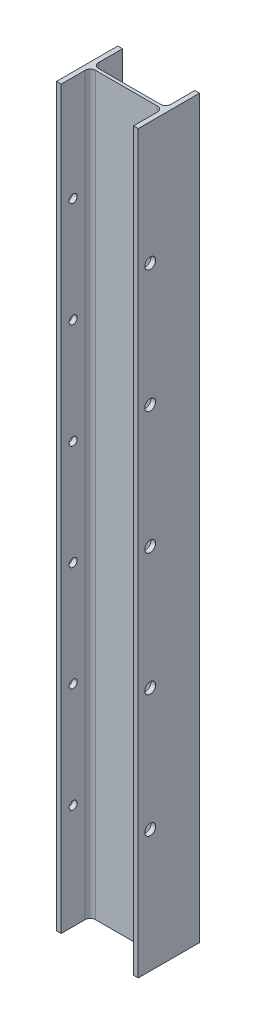
ISO-10303-21;
HEADER;
FILE_DESCRIPTION(('STEP AP214'),'2;1');
FILE_NAME('part.step','',(''),(''),'','','');
FILE_SCHEMA(('AUTOMOTIVE_DESIGN { 1 0 10303 214 1 1 1 1 }'));
ENDSEC;
DATA;
#1=APPLICATION_CONTEXT('core data for automotive mechanical design processes');
#2=APPLICATION_PROTOCOL_DEFINITION('international standard','automotive_design',2000,#1);
#3=PRODUCT_CONTEXT('',#1,'mechanical');
#4=PRODUCT('Part','Part','',(#3));
#5=PRODUCT_RELATED_PRODUCT_CATEGORY('part','',(#4));
#6=PRODUCT_DEFINITION_FORMATION('','',#4);
#7=PRODUCT_DEFINITION_CONTEXT('part definition',#1,'design');
#8=PRODUCT_DEFINITION('design','',#6,#7);
#9=PRODUCT_DEFINITION_SHAPE('','',#8);
#10=(LENGTH_UNIT() NAMED_UNIT(*) SI_UNIT(.MILLI.,.METRE.));
#11=(NAMED_UNIT(*) PLANE_ANGLE_UNIT() SI_UNIT($,.RADIAN.));
#12=(NAMED_UNIT(*) SI_UNIT($,.STERADIAN.) SOLID_ANGLE_UNIT());
#13=UNCERTAINTY_MEASURE_WITH_UNIT(LENGTH_MEASURE(1.E-05),#10,'distance_accuracy_value','');
#14=(GEOMETRIC_REPRESENTATION_CONTEXT(3) GLOBAL_UNCERTAINTY_ASSIGNED_CONTEXT((#13)) GLOBAL_UNIT_ASSIGNED_CONTEXT((#10,
#11,#12)) REPRESENTATION_CONTEXT('',''));
#15=CARTESIAN_POINT('',(0.,0.,0.));
#16=DIRECTION('',(0.,0.,1.));
#17=DIRECTION('',(1.,0.,0.));
#18=AXIS2_PLACEMENT_3D('',#15,#16,#17);
#19=CARTESIAN_POINT('',(98.9330000000001,457.2,-1.38777878078145E-13));
#20=DIRECTION('',(1.,0.,0.));
#21=DIRECTION('',(0.,0.,-1.));
#22=AXIS2_PLACEMENT_3D('',#19,#20,#21);
#23=PLANE('',#22);
#24=CARTESIAN_POINT('',(98.9330000000001,-304.8,-14.9225000000001));
#25=DIRECTION('',(-1.,0.,0.));
#26=DIRECTION('',(0.,0.,1.));
#27=AXIS2_PLACEMENT_3D('',#24,#25,#26);
#28=CIRCLE('',#27,6.74624000000001);
#29=CARTESIAN_POINT('',(98.9330000000001,-304.8,-8.17626000000013));
#30=VERTEX_POINT('',#29);
#31=EDGE_CURVE('E627',#30,#30,#28,.T.);
#32=ORIENTED_EDGE('',*,*,#31,.F.);
#33=EDGE_LOOP('',(#32));
#34=FACE_BOUND('',#33,.T.);
#35=CARTESIAN_POINT('',(98.9330000000001,152.4,-14.9225000000001));
#36=DIRECTION('',(-1.,0.,0.));
#37=DIRECTION('',(0.,0.,1.));
#38=AXIS2_PLACEMENT_3D('',#35,#36,#37);
#39=CIRCLE('',#38,6.74623999999999);
#40=CARTESIAN_POINT('',(98.9330000000001,152.4,-8.17626000000015));
#41=VERTEX_POINT('',#40);
#42=EDGE_CURVE('E639',#41,#41,#39,.T.);
#43=ORIENTED_EDGE('',*,*,#42,.F.);
#44=EDGE_LOOP('',(#43));
#45=FACE_BOUND('',#44,.T.);
#46=DIRECTION('',(0.,0.,1.));
#47=VECTOR('',#46,1.);
#48=CARTESIAN_POINT('',(98.9330000000001,-457.2,-1.38777878078145E-13));
#49=LINE('',#48,#47);
#50=CARTESIAN_POINT('',(98.933,-457.2,-29.8450000000001));
#51=VERTEX_POINT('',#50);
#52=CARTESIAN_POINT('',(98.9330000000001,-457.2,-1.38777878078145E-13));
#53=VERTEX_POINT('',#52);
#54=EDGE_CURVE('E166',#51,#53,#49,.T.);
#55=ORIENTED_EDGE('',*,*,#54,.T.);
#56=DIRECTION('',(0.,-1.,0.));
#57=VECTOR('',#56,1.);
#58=CARTESIAN_POINT('',(98.9330000000001,457.2,-1.38777878078145E-13));
#59=LINE('',#58,#57);
#60=CARTESIAN_POINT('',(98.9330000000001,457.2,-1.38777878078145E-13));
#61=VERTEX_POINT('',#60);
#62=EDGE_CURVE('E233',#61,#53,#59,.T.);
#63=ORIENTED_EDGE('',*,*,#62,.F.);
#64=DIRECTION('',(0.,0.,1.));
#65=VECTOR('',#64,1.);
#66=CARTESIAN_POINT('',(98.9330000000001,457.2,-1.38777878078145E-13));
#67=LINE('',#66,#65);
#68=CARTESIAN_POINT('',(98.933,457.2,-29.8450000000001));
#69=VERTEX_POINT('',#68);
#70=EDGE_CURVE('E221',#69,#61,#67,.T.);
#71=ORIENTED_EDGE('',*,*,#70,.F.);
#72=DIRECTION('',(0.,-1.,0.));
#73=VECTOR('',#72,1.);
#74=CARTESIAN_POINT('',(98.933,457.2,-29.8450000000001));
#75=LINE('',#74,#73);
#76=EDGE_CURVE('E228',#69,#51,#75,.T.);
#77=ORIENTED_EDGE('',*,*,#76,.T.);
#78=EDGE_LOOP('',(#55,#63,#71,#77));
#79=FACE_BOUND('',#78,.T.);
#80=CARTESIAN_POINT('',(98.9330000000001,304.8,-14.9225000000001));
#81=DIRECTION('',(-1.,0.,0.));
#82=DIRECTION('',(0.,0.,1.));
#83=AXIS2_PLACEMENT_3D('',#80,#81,#82);
#84=CIRCLE('',#83,6.74624000000001);
#85=CARTESIAN_POINT('',(98.9330000000001,304.8,-8.17626000000013));
#86=VERTEX_POINT('',#85);
#87=EDGE_CURVE('E441',#86,#86,#84,.T.);
#88=ORIENTED_EDGE('',*,*,#87,.F.);
#89=EDGE_LOOP('',(#88));
#90=FACE_BOUND('',#89,.T.);
#91=CARTESIAN_POINT('',(98.9330000000001,0.,-14.9225000000001));
#92=DIRECTION('',(-1.,0.,0.));
#93=DIRECTION('',(0.,0.,1.));
#94=AXIS2_PLACEMENT_3D('',#91,#92,#93);
#95=CIRCLE('',#94,6.74624);
#96=CARTESIAN_POINT('',(98.9330000000001,0.,-8.17626000000014));
#97=VERTEX_POINT('',#96);
#98=EDGE_CURVE('E635',#97,#97,#95,.T.);
#99=ORIENTED_EDGE('',*,*,#98,.F.);
#100=EDGE_LOOP('',(#99));
#101=FACE_BOUND('',#100,.T.);
#102=CARTESIAN_POINT('',(98.9330000000001,-152.4,-14.9225000000001));
#103=DIRECTION('',(-1.,0.,0.));
#104=DIRECTION('',(0.,0.,1.));
#105=AXIS2_PLACEMENT_3D('',#102,#103,#104);
#106=CIRCLE('',#105,6.74623999999999);
#107=CARTESIAN_POINT('',(98.9330000000001,-152.4,-8.17626000000015));
#108=VERTEX_POINT('',#107);
#109=EDGE_CURVE('E629',#108,#108,#106,.T.);
#110=ORIENTED_EDGE('',*,*,#109,.F.);
#111=EDGE_LOOP('',(#110));
#112=FACE_BOUND('',#111,.T.);
#113=ADVANCED_FACE('F96',(#34,#45,#79,#90,#101,#112),#23,.F.);
#114=CARTESIAN_POINT('',(3.17500000000012,457.2,1.87350135405495E-13));
#115=DIRECTION('',(1.,0.,0.));
#116=DIRECTION('',(0.,0.,-1.));
#117=AXIS2_PLACEMENT_3D('',#114,#115,#116);
#118=PLANE('',#117);
#119=CARTESIAN_POINT('',(3.17500000000006,-65.3142858594286,-14.9224999999999));
#120=DIRECTION('',(-1.,0.,0.));
#121=DIRECTION('',(0.,0.,1.));
#122=AXIS2_PLACEMENT_3D('',#119,#120,#121);
#123=CIRCLE('',#122,5.0419);
#124=CARTESIAN_POINT('',(3.17500000000008,-65.3142858594286,-9.88059999999991));
#125=VERTEX_POINT('',#124);
#126=EDGE_CURVE('E458',#125,#125,#123,.T.);
#127=ORIENTED_EDGE('',*,*,#126,.F.);
#128=EDGE_LOOP('',(#127));
#129=FACE_BOUND('',#128,.T.);
#130=CARTESIAN_POINT('',(3.17500000000006,65.3142854965714,-14.9224999999999));
#131=DIRECTION('',(-1.,0.,0.));
#132=DIRECTION('',(0.,0.,1.));
#133=AXIS2_PLACEMENT_3D('',#130,#131,#132);
#134=CIRCLE('',#133,5.0419);
#135=CARTESIAN_POINT('',(3.17500000000008,65.3142854965714,-9.88059999999991));
#136=VERTEX_POINT('',#135);
#137=EDGE_CURVE('E464',#136,#136,#134,.T.);
#138=ORIENTED_EDGE('',*,*,#137,.F.);
#139=EDGE_LOOP('',(#138));
#140=FACE_BOUND('',#139,.T.);
#141=CARTESIAN_POINT('',(3.17500000000006,195.942856852571,-14.9224999999999));
#142=DIRECTION('',(-1.,0.,0.));
#143=DIRECTION('',(0.,0.,1.));
#144=AXIS2_PLACEMENT_3D('',#141,#142,#143);
#145=CIRCLE('',#144,5.04189999999999);
#146=CARTESIAN_POINT('',(3.17500000000008,195.942856852571,-9.88059999999992));
#147=VERTEX_POINT('',#146);
#148=EDGE_CURVE('E470',#147,#147,#145,.T.);
#149=ORIENTED_EDGE('',*,*,#148,.F.);
#150=EDGE_LOOP('',(#149));
#151=FACE_BOUND('',#150,.T.);
#152=CARTESIAN_POINT('',(3.17500000000006,326.571428208571,-14.9224999999999));
#153=DIRECTION('',(-1.,0.,0.));
#154=DIRECTION('',(0.,0.,1.));
#155=AXIS2_PLACEMENT_3D('',#152,#153,#154);
#156=CIRCLE('',#155,5.04189999999999);
#157=CARTESIAN_POINT('',(3.17500000000008,326.571428208571,-9.88059999999992));
#158=VERTEX_POINT('',#157);
#159=EDGE_CURVE('E476',#158,#158,#156,.T.);
#160=ORIENTED_EDGE('',*,*,#159,.F.);
#161=EDGE_LOOP('',(#160));
#162=FACE_BOUND('',#161,.T.);
#163=DIRECTION('',(0.,0.,1.));
#164=VECTOR('',#163,1.);
#165=CARTESIAN_POINT('',(3.17500000000012,-457.2,1.87350135405495E-13));
#166=LINE('',#165,#164);
#167=CARTESIAN_POINT('',(3.17499999999985,-457.2,-76.1999999999998));
#168=VERTEX_POINT('',#167);
#169=CARTESIAN_POINT('',(3.17500000000012,-457.2,1.87350135405495E-13));
#170=VERTEX_POINT('',#169);
#171=EDGE_CURVE('E259',#168,#170,#166,.T.);
#172=ORIENTED_EDGE('',*,*,#171,.T.);
#173=DIRECTION('',(0.,-1.,0.));
#174=VECTOR('',#173,1.);
#175=CARTESIAN_POINT('',(3.17500000000012,457.2,1.87350135405495E-13));
#176=LINE('',#175,#174);
#177=CARTESIAN_POINT('',(3.17500000000012,457.2,1.87350135405495E-13));
#178=VERTEX_POINT('',#177);
#179=EDGE_CURVE('E285',#178,#170,#176,.T.);
#180=ORIENTED_EDGE('',*,*,#179,.F.);
#181=DIRECTION('',(0.,0.,1.));
#182=VECTOR('',#181,1.);
#183=CARTESIAN_POINT('',(3.17500000000012,457.2,1.87350135405495E-13));
#184=LINE('',#183,#182);
#185=CARTESIAN_POINT('',(3.17499999999985,457.2,-76.1999999999998));
#186=VERTEX_POINT('',#185);
#187=EDGE_CURVE('E339',#186,#178,#184,.T.);
#188=ORIENTED_EDGE('',*,*,#187,.F.);
#189=DIRECTION('',(0.,-1.,0.));
#190=VECTOR('',#189,1.);
#191=CARTESIAN_POINT('',(3.17499999999985,457.2,-76.1999999999998));
#192=LINE('',#191,#190);
#193=EDGE_CURVE('E288',#186,#168,#192,.T.);
#194=ORIENTED_EDGE('',*,*,#193,.T.);
#195=EDGE_LOOP('',(#172,#180,#188,#194));
#196=FACE_BOUND('',#195,.T.);
#197=CARTESIAN_POINT('',(3.17500000000006,-326.571428571429,-14.9224999999999));
#198=DIRECTION('',(-1.,0.,0.));
#199=DIRECTION('',(0.,0.,1.));
#200=AXIS2_PLACEMENT_3D('',#197,#198,#199);
#201=CIRCLE('',#200,5.04189999999999);
#202=CARTESIAN_POINT('',(3.17500000000008,-326.571428571429,-9.88059999999992));
#203=VERTEX_POINT('',#202);
#204=EDGE_CURVE('E452',#203,#203,#201,.T.);
#205=ORIENTED_EDGE('',*,*,#204,.F.);
#206=EDGE_LOOP('',(#205));
#207=FACE_BOUND('',#206,.T.);
#208=CARTESIAN_POINT('',(3.17500000000006,-195.942857215429,-14.9224999999999));
#209=DIRECTION('',(-1.,0.,0.));
#210=DIRECTION('',(0.,0.,1.));
#211=AXIS2_PLACEMENT_3D('',#208,#209,#210);
#212=CIRCLE('',#211,5.04189999999999);
#213=CARTESIAN_POINT('',(3.17500000000008,-195.942857215429,-9.88059999999992));
#214=VERTEX_POINT('',#213);
#215=EDGE_CURVE('E440',#214,#214,#212,.T.);
#216=ORIENTED_EDGE('',*,*,#215,.F.);
#217=EDGE_LOOP('',(#216));
#218=FACE_BOUND('',#217,.T.);
#219=ADVANCED_FACE('F371',(#129,#140,#151,#162,#196,#207,#218),#118,.F.);
#220=CARTESIAN_POINT('',(104.775,457.2,-76.2000000000002));
#221=DIRECTION('',(-1.,0.,0.));
#222=DIRECTION('',(0.,0.,1.));
#223=AXIS2_PLACEMENT_3D('',#220,#221,#222);
#224=PLANE('',#223);
#225=CARTESIAN_POINT('',(104.775,-304.8,-14.9225000000002));
#226=DIRECTION('',(-1.,0.,0.));
#227=DIRECTION('',(0.,0.,1.));
#228=AXIS2_PLACEMENT_3D('',#225,#226,#227);
#229=CIRCLE('',#228,6.74624000000001);
#230=CARTESIAN_POINT('',(104.775,-304.8,-8.17626000000015));
#231=VERTEX_POINT('',#230);
#232=EDGE_CURVE('E423',#231,#231,#229,.T.);
#233=ORIENTED_EDGE('',*,*,#232,.T.);
#234=EDGE_LOOP('',(#233));
#235=FACE_BOUND('',#234,.T.);
#236=CARTESIAN_POINT('',(104.775,-152.4,-14.9225000000002));
#237=DIRECTION('',(-1.,0.,0.));
#238=DIRECTION('',(0.,0.,1.));
#239=AXIS2_PLACEMENT_3D('',#236,#237,#238);
#240=CIRCLE('',#239,6.74623999999999);
#241=CARTESIAN_POINT('',(104.775,-152.4,-8.17626000000018));
#242=VERTEX_POINT('',#241);
#243=EDGE_CURVE('E427',#242,#242,#240,.T.);
#244=ORIENTED_EDGE('',*,*,#243,.T.);
#245=EDGE_LOOP('',(#244));
#246=FACE_BOUND('',#245,.T.);
#247=CARTESIAN_POINT('',(104.775,0.,-14.9225000000002));
#248=DIRECTION('',(-1.,0.,0.));
#249=DIRECTION('',(0.,0.,1.));
#250=AXIS2_PLACEMENT_3D('',#247,#248,#249);
#251=CIRCLE('',#250,6.74624);
#252=CARTESIAN_POINT('',(104.775,0.,-8.17626000000016));
#253=VERTEX_POINT('',#252);
#254=EDGE_CURVE('E431',#253,#253,#251,.T.);
#255=ORIENTED_EDGE('',*,*,#254,.T.);
#256=EDGE_LOOP('',(#255));
#257=FACE_BOUND('',#256,.T.);
#258=CARTESIAN_POINT('',(104.775,152.4,-14.9225000000002));
#259=DIRECTION('',(-1.,0.,0.));
#260=DIRECTION('',(0.,0.,1.));
#261=AXIS2_PLACEMENT_3D('',#258,#259,#260);
#262=CIRCLE('',#261,6.74623999999999);
#263=CARTESIAN_POINT('',(104.775,152.4,-8.17626000000018));
#264=VERTEX_POINT('',#263);
#265=EDGE_CURVE('E435',#264,#264,#262,.T.);
#266=ORIENTED_EDGE('',*,*,#265,.T.);
#267=EDGE_LOOP('',(#266));
#268=FACE_BOUND('',#267,.T.);
#269=CARTESIAN_POINT('',(104.775,304.8,-14.9225000000002));
#270=DIRECTION('',(-1.,0.,0.));
#271=DIRECTION('',(0.,0.,1.));
#272=AXIS2_PLACEMENT_3D('',#269,#270,#271);
#273=CIRCLE('',#272,6.74624000000001);
#274=CARTESIAN_POINT('',(104.775,304.8,-8.17626000000015));
#275=VERTEX_POINT('',#274);
#276=EDGE_CURVE('E438',#275,#275,#273,.T.);
#277=ORIENTED_EDGE('',*,*,#276,.T.);
#278=EDGE_LOOP('',(#277));
#279=FACE_BOUND('',#278,.T.);
#280=DIRECTION('',(0.,0.,-1.));
#281=VECTOR('',#280,1.);
#282=CARTESIAN_POINT('',(104.775,-457.2,-76.2000000000002));
#283=LINE('',#282,#281);
#284=CARTESIAN_POINT('',(104.775,-457.2,-1.59594559789866E-13));
#285=VERTEX_POINT('',#284);
#286=CARTESIAN_POINT('',(104.775,-457.2,-76.2000000000002));
#287=VERTEX_POINT('',#286);
#288=EDGE_CURVE('E241',#285,#287,#283,.T.);
#289=ORIENTED_EDGE('',*,*,#288,.T.);
#290=DIRECTION('',(0.,-1.,0.));
#291=VECTOR('',#290,1.);
#292=CARTESIAN_POINT('',(104.775,457.2,-76.2000000000002));
#293=LINE('',#292,#291);
#294=CARTESIAN_POINT('',(104.775,457.2,-76.2000000000002));
#295=VERTEX_POINT('',#294);
#296=EDGE_CURVE('E13',#295,#287,#293,.T.);
#297=ORIENTED_EDGE('',*,*,#296,.F.);
#298=DIRECTION('',(0.,0.,-1.));
#299=VECTOR('',#298,1.);
#300=CARTESIAN_POINT('',(104.775,457.2,-76.2000000000002));
#301=LINE('',#300,#299);
#302=CARTESIAN_POINT('',(104.775,457.2,-1.59594559789866E-13));
#303=VERTEX_POINT('',#302);
#304=EDGE_CURVE('E272',#303,#295,#301,.T.);
#305=ORIENTED_EDGE('',*,*,#304,.F.);
#306=DIRECTION('',(0.,-1.,0.));
#307=VECTOR('',#306,1.);
#308=CARTESIAN_POINT('',(104.775,457.2,-1.59594559789866E-13));
#309=LINE('',#308,#307);
#310=EDGE_CURVE('E237',#303,#285,#309,.T.);
#311=ORIENTED_EDGE('',*,*,#310,.T.);
#312=EDGE_LOOP('',(#289,#297,#305,#311));
#313=FACE_BOUND('',#312,.T.);
#314=ADVANCED_FACE('F98',(#235,#246,#257,#268,#279,#313),#224,.F.);
#315=CARTESIAN_POINT('',(98.9329999999999,457.2,-76.2000000000002));
#316=DIRECTION('',(0.,0.,1.));
#317=DIRECTION('',(1.,0.,0.));
#318=AXIS2_PLACEMENT_3D('',#315,#316,#317);
#319=PLANE('',#318);
#320=DIRECTION('',(-1.,0.,0.));
#321=VECTOR('',#320,1.);
#322=CARTESIAN_POINT('',(98.9329999999999,-457.2,-76.2000000000002));
#323=LINE('',#322,#321);
#324=CARTESIAN_POINT('',(98.9329999999999,-457.2,-76.2000000000002));
#325=VERTEX_POINT('',#324);
#326=EDGE_CURVE('E244',#287,#325,#323,.T.);
#327=ORIENTED_EDGE('',*,*,#326,.T.);
#328=DIRECTION('',(0.,-1.,0.));
#329=VECTOR('',#328,1.);
#330=CARTESIAN_POINT('',(98.9329999999999,457.2,-76.2000000000002));
#331=LINE('',#330,#329);
#332=CARTESIAN_POINT('',(98.9329999999999,457.2,-76.2000000000002));
#333=VERTEX_POINT('',#332);
#334=EDGE_CURVE('E105',#333,#325,#331,.T.);
#335=ORIENTED_EDGE('',*,*,#334,.F.);
#336=DIRECTION('',(-1.,0.,0.));
#337=VECTOR('',#336,1.);
#338=CARTESIAN_POINT('',(98.9329999999999,457.2,-76.2000000000002));
#339=LINE('',#338,#337);
#340=EDGE_CURVE('E180',#295,#333,#339,.T.);
#341=ORIENTED_EDGE('',*,*,#340,.F.);
#342=ORIENTED_EDGE('',*,*,#296,.T.);
#343=EDGE_LOOP('',(#327,#335,#341,#342));
#344=FACE_BOUND('',#343,.T.);
#345=ADVANCED_FACE('F412',(#344),#319,.F.);
#346=CARTESIAN_POINT('',(98.933,457.2,-46.3550000000002));
#347=DIRECTION('',(1.,0.,0.));
#348=DIRECTION('',(0.,0.,-1.));
#349=AXIS2_PLACEMENT_3D('',#346,#347,#348);
#350=PLANE('',#349);
#351=DIRECTION('',(0.,0.,1.));
#352=VECTOR('',#351,1.);
#353=CARTESIAN_POINT('',(98.933,-457.2,-46.3550000000002));
#354=LINE('',#353,#352);
#355=CARTESIAN_POINT('',(98.933,-457.2,-46.3550000000002));
#356=VERTEX_POINT('',#355);
#357=EDGE_CURVE('E247',#325,#356,#354,.T.);
#358=ORIENTED_EDGE('',*,*,#357,.T.);
#359=DIRECTION('',(0.,-1.,0.));
#360=VECTOR('',#359,1.);
#361=CARTESIAN_POINT('',(98.933,457.2,-46.3550000000002));
#362=LINE('',#361,#360);
#363=CARTESIAN_POINT('',(98.933,457.2,-46.3550000000002));
#364=VERTEX_POINT('',#363);
#365=EDGE_CURVE('E303',#364,#356,#362,.T.);
#366=ORIENTED_EDGE('',*,*,#365,.F.);
#367=DIRECTION('',(0.,0.,1.));
#368=VECTOR('',#367,1.);
#369=CARTESIAN_POINT('',(98.933,457.2,-46.3550000000002));
#370=LINE('',#369,#368);
#371=EDGE_CURVE('E311',#333,#364,#370,.T.);
#372=ORIENTED_EDGE('',*,*,#371,.F.);
#373=ORIENTED_EDGE('',*,*,#334,.T.);
#374=EDGE_LOOP('',(#358,#366,#372,#373));
#375=FACE_BOUND('',#374,.T.);
#376=ADVANCED_FACE('F309',(#375),#350,.F.);
#377=CARTESIAN_POINT('',(92.5829999999999,457.2,-46.3550000000001));
#378=DIRECTION('',(0.,-1.,0.));
#379=DIRECTION('',(0.,0.,-1.));
#380=AXIS2_PLACEMENT_3D('',#377,#378,#379);
#381=CYLINDRICAL_SURFACE('',#380,6.35000000000001);
#382=CARTESIAN_POINT('',(92.5829999999999,-457.2,-46.3550000000001));
#383=DIRECTION('',(0.,-1.,0.));
#384=DIRECTION('',(0.,0.,1.));
#385=AXIS2_PLACEMENT_3D('',#382,#383,#384);
#386=CIRCLE('',#385,6.35000000000001);
#387=CARTESIAN_POINT('',(92.583,-457.2,-40.0050000000002));
#388=VERTEX_POINT('',#387);
#389=EDGE_CURVE('E249',#356,#388,#386,.T.);
#390=ORIENTED_EDGE('',*,*,#389,.T.);
#391=DIRECTION('',(0.,-1.,0.));
#392=VECTOR('',#391,1.);
#393=CARTESIAN_POINT('',(92.583,457.2,-40.0050000000002));
#394=LINE('',#393,#392);
#395=CARTESIAN_POINT('',(92.583,457.2,-40.0050000000002));
#396=VERTEX_POINT('',#395);
#397=EDGE_CURVE('E300',#396,#388,#394,.T.);
#398=ORIENTED_EDGE('',*,*,#397,.F.);
#399=CARTESIAN_POINT('',(92.5829999999999,457.2,-46.3550000000001));
#400=DIRECTION('',(0.,-1.,0.));
#401=DIRECTION('',(0.,0.,1.));
#402=AXIS2_PLACEMENT_3D('',#399,#400,#401);
#403=CIRCLE('',#402,6.35000000000001);
#404=EDGE_CURVE('E329',#364,#396,#403,.T.);
#405=ORIENTED_EDGE('',*,*,#404,.F.);
#406=ORIENTED_EDGE('',*,*,#365,.T.);
#407=EDGE_LOOP('',(#390,#398,#405,#406));
#408=FACE_BOUND('',#407,.T.);
#409=ADVANCED_FACE('F320',(#408),#381,.F.);
#410=CARTESIAN_POINT('',(15.367,457.2,-40.0049999999999));
#411=DIRECTION('',(0.,0.,1.));
#412=DIRECTION('',(1.,0.,0.));
#413=AXIS2_PLACEMENT_3D('',#410,#411,#412);
#414=PLANE('',#413);
#415=DIRECTION('',(-1.,0.,0.));
#416=VECTOR('',#415,1.);
#417=CARTESIAN_POINT('',(15.367,-457.2,-40.0049999999999));
#418=LINE('',#417,#416);
#419=CARTESIAN_POINT('',(15.367,-457.2,-40.0049999999999));
#420=VERTEX_POINT('',#419);
#421=EDGE_CURVE('E251',#388,#420,#418,.T.);
#422=ORIENTED_EDGE('',*,*,#421,.T.);
#423=DIRECTION('',(0.,-1.,0.));
#424=VECTOR('',#423,1.);
#425=CARTESIAN_POINT('',(15.367,457.2,-40.0049999999999));
#426=LINE('',#425,#424);
#427=CARTESIAN_POINT('',(15.367,457.2,-40.0049999999999));
#428=VERTEX_POINT('',#427);
#429=EDGE_CURVE('E297',#428,#420,#426,.T.);
#430=ORIENTED_EDGE('',*,*,#429,.F.);
#431=DIRECTION('',(-1.,0.,0.));
#432=VECTOR('',#431,1.);
#433=CARTESIAN_POINT('',(15.367,457.2,-40.0049999999999));
#434=LINE('',#433,#432);
#435=EDGE_CURVE('E326',#396,#428,#434,.T.);
#436=ORIENTED_EDGE('',*,*,#435,.F.);
#437=ORIENTED_EDGE('',*,*,#397,.T.);
#438=EDGE_LOOP('',(#422,#430,#436,#437));
#439=FACE_BOUND('',#438,.T.);
#440=ADVANCED_FACE('F324',(#439),#414,.F.);
#441=CARTESIAN_POINT('',(15.367,457.2,-46.3549999999999));
#442=DIRECTION('',(0.,-1.,0.));
#443=DIRECTION('',(0.,0.,-1.));
#444=AXIS2_PLACEMENT_3D('',#441,#442,#443);
#445=CYLINDRICAL_SURFACE('',#444,6.35000000000001);
#446=CARTESIAN_POINT('',(15.367,-457.2,-46.3549999999999));
#447=DIRECTION('',(0.,-1.,0.));
#448=DIRECTION('',(0.,0.,1.));
#449=AXIS2_PLACEMENT_3D('',#446,#447,#448);
#450=CIRCLE('',#449,6.35000000000001);
#451=CARTESIAN_POINT('',(9.01699999999996,-457.2,-46.3549999999999));
#452=VERTEX_POINT('',#451);
#453=EDGE_CURVE('E253',#420,#452,#450,.T.);
#454=ORIENTED_EDGE('',*,*,#453,.T.);
#455=DIRECTION('',(0.,-1.,0.));
#456=VECTOR('',#455,1.);
#457=CARTESIAN_POINT('',(9.01699999999996,457.2,-46.3549999999999));
#458=LINE('',#457,#456);
#459=CARTESIAN_POINT('',(9.01699999999996,457.2,-46.3549999999999));
#460=VERTEX_POINT('',#459);
#461=EDGE_CURVE('E294',#460,#452,#458,.T.);
#462=ORIENTED_EDGE('',*,*,#461,.F.);
#463=CARTESIAN_POINT('',(15.367,457.2,-46.3549999999999));
#464=DIRECTION('',(0.,-1.,0.));
#465=DIRECTION('',(0.,0.,1.));
#466=AXIS2_PLACEMENT_3D('',#463,#464,#465);
#467=CIRCLE('',#466,6.35000000000001);
#468=EDGE_CURVE('E328',#428,#460,#467,.T.);
#469=ORIENTED_EDGE('',*,*,#468,.F.);
#470=ORIENTED_EDGE('',*,*,#429,.T.);
#471=EDGE_LOOP('',(#454,#462,#469,#470));
#472=FACE_BOUND('',#471,.T.);
#473=ADVANCED_FACE('F402',(#472),#445,.F.);
#474=CARTESIAN_POINT('',(9.01699999999987,457.2,-76.1999999999999));
#475=DIRECTION('',(-1.,0.,0.));
#476=DIRECTION('',(0.,0.,1.));
#477=AXIS2_PLACEMENT_3D('',#474,#475,#476);
#478=PLANE('',#477);
#479=DIRECTION('',(0.,0.,-1.));
#480=VECTOR('',#479,1.);
#481=CARTESIAN_POINT('',(9.01699999999987,-457.2,-76.1999999999999));
#482=LINE('',#481,#480);
#483=CARTESIAN_POINT('',(9.01699999999987,-457.2,-76.1999999999999));
#484=VERTEX_POINT('',#483);
#485=EDGE_CURVE('E255',#452,#484,#482,.T.);
#486=ORIENTED_EDGE('',*,*,#485,.T.);
#487=DIRECTION('',(0.,-1.,0.));
#488=VECTOR('',#487,1.);
#489=CARTESIAN_POINT('',(9.01699999999987,457.2,-76.1999999999999));
#490=LINE('',#489,#488);
#491=CARTESIAN_POINT('',(9.01699999999987,457.2,-76.1999999999999));
#492=VERTEX_POINT('',#491);
#493=EDGE_CURVE('E291',#492,#484,#490,.T.);
#494=ORIENTED_EDGE('',*,*,#493,.F.);
#495=DIRECTION('',(0.,0.,-1.));
#496=VECTOR('',#495,1.);
#497=CARTESIAN_POINT('',(9.01699999999987,457.2,-76.1999999999999));
#498=LINE('',#497,#496);
#499=EDGE_CURVE('E331',#460,#492,#498,.T.);
#500=ORIENTED_EDGE('',*,*,#499,.F.);
#501=ORIENTED_EDGE('',*,*,#461,.T.);
#502=EDGE_LOOP('',(#486,#494,#500,#501));
#503=FACE_BOUND('',#502,.T.);
#504=ADVANCED_FACE('F398',(#503),#478,.F.);
#505=CARTESIAN_POINT('',(3.17499999999985,457.2,-76.1999999999998));
#506=DIRECTION('',(0.,0.,1.));
#507=DIRECTION('',(1.,0.,0.));
#508=AXIS2_PLACEMENT_3D('',#505,#506,#507);
#509=PLANE('',#508);
#510=DIRECTION('',(-1.,0.,0.));
#511=VECTOR('',#510,1.);
#512=CARTESIAN_POINT('',(3.17499999999985,-457.2,-76.1999999999998));
#513=LINE('',#512,#511);
#514=EDGE_CURVE('E257',#484,#168,#513,.T.);
#515=ORIENTED_EDGE('',*,*,#514,.T.);
#516=ORIENTED_EDGE('',*,*,#193,.F.);
#517=DIRECTION('',(-1.,0.,0.));
#518=VECTOR('',#517,1.);
#519=CARTESIAN_POINT('',(3.17499999999985,457.2,-76.1999999999998));
#520=LINE('',#519,#518);
#521=EDGE_CURVE('E337',#492,#186,#520,.T.);
#522=ORIENTED_EDGE('',*,*,#521,.F.);
#523=ORIENTED_EDGE('',*,*,#493,.T.);
#524=EDGE_LOOP('',(#515,#516,#522,#523));
#525=FACE_BOUND('',#524,.T.);
#526=ADVANCED_FACE('F393',(#525),#509,.F.);
#527=CARTESIAN_POINT('',(9.01700000000014,457.2,1.94289029309402E-13));
#528=DIRECTION('',(0.,0.,-1.));
#529=DIRECTION('',(-1.,0.,0.));
#530=AXIS2_PLACEMENT_3D('',#527,#528,#529);
#531=PLANE('',#530);
#532=DIRECTION('',(1.,0.,0.));
#533=VECTOR('',#532,1.);
#534=CARTESIAN_POINT('',(9.01700000000014,-457.2,1.94289029309402E-13));
#535=LINE('',#534,#533);
#536=CARTESIAN_POINT('',(9.01700000000014,-457.2,1.94289029309402E-13));
#537=VERTEX_POINT('',#536);
#538=EDGE_CURVE('E261',#170,#537,#535,.T.);
#539=ORIENTED_EDGE('',*,*,#538,.T.);
#540=DIRECTION('',(0.,-1.,0.));
#541=VECTOR('',#540,1.);
#542=CARTESIAN_POINT('',(9.01700000000014,457.2,1.94289029309402E-13));
#543=LINE('',#542,#541);
#544=CARTESIAN_POINT('',(9.01700000000014,457.2,1.94289029309402E-13));
#545=VERTEX_POINT('',#544);
#546=EDGE_CURVE('E282',#545,#537,#543,.T.);
#547=ORIENTED_EDGE('',*,*,#546,.F.);
#548=DIRECTION('',(1.,0.,0.));
#549=VECTOR('',#548,1.);
#550=CARTESIAN_POINT('',(9.01700000000014,457.2,1.94289029309402E-13));
#551=LINE('',#550,#549);
#552=EDGE_CURVE('E341',#178,#545,#551,.T.);
#553=ORIENTED_EDGE('',*,*,#552,.F.);
#554=ORIENTED_EDGE('',*,*,#179,.T.);
#555=EDGE_LOOP('',(#539,#547,#553,#554));
#556=FACE_BOUND('',#555,.T.);
#557=ADVANCED_FACE('F390',(#556),#531,.F.);
#558=CARTESIAN_POINT('',(9.01700000000002,457.2,-29.8449999999998));
#559=DIRECTION('',(-1.,0.,0.));
#560=DIRECTION('',(0.,0.,1.));
#561=AXIS2_PLACEMENT_3D('',#558,#559,#560);
#562=PLANE('',#561);
#563=CARTESIAN_POINT('',(9.01700000000008,-195.942857215429,-14.9224999999999));
#564=DIRECTION('',(-1.,0.,0.));
#565=DIRECTION('',(0.,0.,1.));
#566=AXIS2_PLACEMENT_3D('',#563,#564,#565);
#567=CIRCLE('',#566,5.04189999999999);
#568=CARTESIAN_POINT('',(9.0170000000001,-195.942857215429,-9.88059999999994));
#569=VERTEX_POINT('',#568);
#570=EDGE_CURVE('E444',#569,#569,#567,.T.);
#571=ORIENTED_EDGE('',*,*,#570,.T.);
#572=EDGE_LOOP('',(#571));
#573=FACE_BOUND('',#572,.T.);
#574=CARTESIAN_POINT('',(9.01700000000008,-326.571428571429,-14.9224999999999));
#575=DIRECTION('',(-1.,0.,0.));
#576=DIRECTION('',(0.,0.,1.));
#577=AXIS2_PLACEMENT_3D('',#574,#575,#576);
#578=CIRCLE('',#577,5.04189999999999);
#579=CARTESIAN_POINT('',(9.0170000000001,-326.571428571429,-9.88059999999994));
#580=VERTEX_POINT('',#579);
#581=EDGE_CURVE('E455',#580,#580,#578,.T.);
#582=ORIENTED_EDGE('',*,*,#581,.T.);
#583=EDGE_LOOP('',(#582));
#584=FACE_BOUND('',#583,.T.);
#585=CARTESIAN_POINT('',(9.01700000000008,-65.3142858594286,-14.9224999999999));
#586=DIRECTION('',(-1.,0.,0.));
#587=DIRECTION('',(0.,0.,1.));
#588=AXIS2_PLACEMENT_3D('',#585,#586,#587);
#589=CIRCLE('',#588,5.04189999999999);
#590=CARTESIAN_POINT('',(9.0170000000001,-65.3142858594286,-9.88059999999994));
#591=VERTEX_POINT('',#590);
#592=EDGE_CURVE('E461',#591,#591,#589,.T.);
#593=ORIENTED_EDGE('',*,*,#592,.T.);
#594=EDGE_LOOP('',(#593));
#595=FACE_BOUND('',#594,.T.);
#596=CARTESIAN_POINT('',(9.01700000000008,65.3142854965714,-14.9224999999999));
#597=DIRECTION('',(-1.,0.,0.));
#598=DIRECTION('',(0.,0.,1.));
#599=AXIS2_PLACEMENT_3D('',#596,#597,#598);
#600=CIRCLE('',#599,5.04189999999999);
#601=CARTESIAN_POINT('',(9.0170000000001,65.3142854965714,-9.88059999999994));
#602=VERTEX_POINT('',#601);
#603=EDGE_CURVE('E467',#602,#602,#600,.T.);
#604=ORIENTED_EDGE('',*,*,#603,.T.);
#605=EDGE_LOOP('',(#604));
#606=FACE_BOUND('',#605,.T.);
#607=CARTESIAN_POINT('',(9.01700000000008,195.942856852571,-14.9224999999999));
#608=DIRECTION('',(-1.,0.,0.));
#609=DIRECTION('',(0.,0.,1.));
#610=AXIS2_PLACEMENT_3D('',#607,#608,#609);
#611=CIRCLE('',#610,5.04189999999999);
#612=CARTESIAN_POINT('',(9.0170000000001,195.942856852571,-9.88059999999994));
#613=VERTEX_POINT('',#612);
#614=EDGE_CURVE('E473',#613,#613,#611,.T.);
#615=ORIENTED_EDGE('',*,*,#614,.T.);
#616=EDGE_LOOP('',(#615));
#617=FACE_BOUND('',#616,.T.);
#618=CARTESIAN_POINT('',(9.01700000000008,326.571428208571,-14.9224999999999));
#619=DIRECTION('',(-1.,0.,0.));
#620=DIRECTION('',(0.,0.,1.));
#621=AXIS2_PLACEMENT_3D('',#618,#619,#620);
#622=CIRCLE('',#621,5.04189999999999);
#623=CARTESIAN_POINT('',(9.0170000000001,326.571428208571,-9.88059999999994));
#624=VERTEX_POINT('',#623);
#625=EDGE_CURVE('E245',#624,#624,#622,.T.);
#626=ORIENTED_EDGE('',*,*,#625,.T.);
#627=EDGE_LOOP('',(#626));
#628=FACE_BOUND('',#627,.T.);
#629=DIRECTION('',(0.,0.,-1.));
#630=VECTOR('',#629,1.);
#631=CARTESIAN_POINT('',(9.01700000000002,-457.2,-29.8449999999998));
#632=LINE('',#631,#630);
#633=CARTESIAN_POINT('',(9.01700000000003,-457.2,-29.8449999999998));
#634=VERTEX_POINT('',#633);
#635=EDGE_CURVE('E263',#537,#634,#632,.T.);
#636=ORIENTED_EDGE('',*,*,#635,.T.);
#637=DIRECTION('',(0.,-1.,0.));
#638=VECTOR('',#637,1.);
#639=CARTESIAN_POINT('',(9.01700000000003,457.2,-29.8449999999998));
#640=LINE('',#639,#638);
#641=CARTESIAN_POINT('',(9.01700000000003,457.2,-29.8449999999998));
#642=VERTEX_POINT('',#641);
#643=EDGE_CURVE('E279',#642,#634,#640,.T.);
#644=ORIENTED_EDGE('',*,*,#643,.F.);
#645=DIRECTION('',(0.,0.,-1.));
#646=VECTOR('',#645,1.);
#647=CARTESIAN_POINT('',(9.01700000000002,457.2,-29.8449999999998));
#648=LINE('',#647,#646);
#649=EDGE_CURVE('E343',#545,#642,#648,.T.);
#650=ORIENTED_EDGE('',*,*,#649,.F.);
#651=ORIENTED_EDGE('',*,*,#546,.T.);
#652=EDGE_LOOP('',(#636,#644,#650,#651));
#653=FACE_BOUND('',#652,.T.);
#654=ADVANCED_FACE('F387',(#573,#584,#595,#606,#617,#628,#653),#562,.F.);
#655=CARTESIAN_POINT('',(15.367,457.2,-29.8449999999999));
#656=DIRECTION('',(0.,-1.,0.));
#657=DIRECTION('',(0.,0.,-1.));
#658=AXIS2_PLACEMENT_3D('',#655,#656,#657);
#659=CYLINDRICAL_SURFACE('',#658,6.35000000000001);
#660=CARTESIAN_POINT('',(15.367,-457.2,-29.8449999999999));
#661=DIRECTION('',(0.,-1.,0.));
#662=DIRECTION('',(0.,0.,1.));
#663=AXIS2_PLACEMENT_3D('',#660,#661,#662);
#664=CIRCLE('',#663,6.35000000000001);
#665=CARTESIAN_POINT('',(15.367,-457.2,-36.1949999999999));
#666=VERTEX_POINT('',#665);
#667=EDGE_CURVE('E265',#634,#666,#664,.T.);
#668=ORIENTED_EDGE('',*,*,#667,.T.);
#669=DIRECTION('',(0.,-1.,0.));
#670=VECTOR('',#669,1.);
#671=CARTESIAN_POINT('',(15.367,457.2,-36.1949999999999));
#672=LINE('',#671,#670);
#673=CARTESIAN_POINT('',(15.367,457.2,-36.1949999999999));
#674=VERTEX_POINT('',#673);
#675=EDGE_CURVE('E276',#674,#666,#672,.T.);
#676=ORIENTED_EDGE('',*,*,#675,.F.);
#677=CARTESIAN_POINT('',(15.367,457.2,-29.8449999999999));
#678=DIRECTION('',(0.,-1.,0.));
#679=DIRECTION('',(0.,0.,1.));
#680=AXIS2_PLACEMENT_3D('',#677,#678,#679);
#681=CIRCLE('',#680,6.35000000000001);
#682=EDGE_CURVE('E345',#642,#674,#681,.T.);
#683=ORIENTED_EDGE('',*,*,#682,.F.);
#684=ORIENTED_EDGE('',*,*,#643,.T.);
#685=EDGE_LOOP('',(#668,#676,#683,#684));
#686=FACE_BOUND('',#685,.T.);
#687=ADVANCED_FACE('F351',(#686),#659,.F.);
#688=CARTESIAN_POINT('',(92.583,457.2,-36.1950000000001));
#689=DIRECTION('',(0.,0.,-1.));
#690=DIRECTION('',(-1.,0.,0.));
#691=AXIS2_PLACEMENT_3D('',#688,#689,#690);
#692=PLANE('',#691);
#693=DIRECTION('',(1.,0.,0.));
#694=VECTOR('',#693,1.);
#695=CARTESIAN_POINT('',(92.583,-457.2,-36.1950000000001));
#696=LINE('',#695,#694);
#697=CARTESIAN_POINT('',(92.583,-457.2,-36.1950000000001));
#698=VERTEX_POINT('',#697);
#699=EDGE_CURVE('E267',#666,#698,#696,.T.);
#700=ORIENTED_EDGE('',*,*,#699,.T.);
#701=DIRECTION('',(0.,-1.,0.));
#702=VECTOR('',#701,1.);
#703=CARTESIAN_POINT('',(92.583,457.2,-36.1950000000001));
#704=LINE('',#703,#702);
#705=CARTESIAN_POINT('',(92.583,457.2,-36.1950000000001));
#706=VERTEX_POINT('',#705);
#707=EDGE_CURVE('E232',#706,#698,#704,.T.);
#708=ORIENTED_EDGE('',*,*,#707,.F.);
#709=DIRECTION('',(1.,0.,0.));
#710=VECTOR('',#709,1.);
#711=CARTESIAN_POINT('',(92.583,457.2,-36.1950000000001));
#712=LINE('',#711,#710);
#713=EDGE_CURVE('E223',#674,#706,#712,.T.);
#714=ORIENTED_EDGE('',*,*,#713,.F.);
#715=ORIENTED_EDGE('',*,*,#675,.T.);
#716=EDGE_LOOP('',(#700,#708,#714,#715));
#717=FACE_BOUND('',#716,.T.);
#718=ADVANCED_FACE('F355',(#717),#692,.F.);
#719=CARTESIAN_POINT('',(92.583,457.2,-29.8450000000001));
#720=DIRECTION('',(0.,-1.,0.));
#721=DIRECTION('',(0.,0.,-1.));
#722=AXIS2_PLACEMENT_3D('',#719,#720,#721);
#723=CYLINDRICAL_SURFACE('',#722,6.35000000000001);
#724=CARTESIAN_POINT('',(92.583,-457.2,-29.8450000000001));
#725=DIRECTION('',(0.,-1.,0.));
#726=DIRECTION('',(0.,0.,1.));
#727=AXIS2_PLACEMENT_3D('',#724,#725,#726);
#728=CIRCLE('',#727,6.35000000000001);
#729=EDGE_CURVE('E231',#698,#51,#728,.T.);
#730=ORIENTED_EDGE('',*,*,#729,.T.);
#731=ORIENTED_EDGE('',*,*,#76,.F.);
#732=CARTESIAN_POINT('',(92.583,457.2,-29.8450000000001));
#733=DIRECTION('',(0.,-1.,0.));
#734=DIRECTION('',(0.,0.,1.));
#735=AXIS2_PLACEMENT_3D('',#732,#733,#734);
#736=CIRCLE('',#735,6.35000000000001);
#737=EDGE_CURVE('E217',#706,#69,#736,.T.);
#738=ORIENTED_EDGE('',*,*,#737,.F.);
#739=ORIENTED_EDGE('',*,*,#707,.T.);
#740=EDGE_LOOP('',(#730,#731,#738,#739));
#741=FACE_BOUND('',#740,.T.);
#742=ADVANCED_FACE('F229',(#741),#723,.F.);
#743=CARTESIAN_POINT('',(104.775,457.2,-1.59594559789866E-13));
#744=DIRECTION('',(0.,0.,-1.));
#745=DIRECTION('',(-1.,0.,0.));
#746=AXIS2_PLACEMENT_3D('',#743,#744,#745);
#747=PLANE('',#746);
#748=DIRECTION('',(1.,0.,0.));
#749=VECTOR('',#748,1.);
#750=CARTESIAN_POINT('',(104.775,-457.2,-1.59594559789866E-13));
#751=LINE('',#750,#749);
#752=EDGE_CURVE('E172',#53,#285,#751,.T.);
#753=ORIENTED_EDGE('',*,*,#752,.T.);
#754=ORIENTED_EDGE('',*,*,#310,.F.);
#755=DIRECTION('',(1.,0.,0.));
#756=VECTOR('',#755,1.);
#757=CARTESIAN_POINT('',(104.775,457.2,-1.59594559789866E-13));
#758=LINE('',#757,#756);
#759=EDGE_CURVE('E113',#61,#303,#758,.T.);
#760=ORIENTED_EDGE('',*,*,#759,.F.);
#761=ORIENTED_EDGE('',*,*,#62,.T.);
#762=EDGE_LOOP('',(#753,#754,#760,#761));
#763=FACE_BOUND('',#762,.T.);
#764=ADVANCED_FACE('F359',(#763),#747,.F.);
#765=CARTESIAN_POINT('',(92.583,457.2,-29.8450000000001));
#766=DIRECTION('',(0.,1.,0.));
#767=DIRECTION('',(0.,0.,1.));
#768=AXIS2_PLACEMENT_3D('',#765,#766,#767);
#769=PLANE('',#768);
#770=ORIENTED_EDGE('',*,*,#304,.T.);
#771=ORIENTED_EDGE('',*,*,#340,.T.);
#772=ORIENTED_EDGE('',*,*,#371,.T.);
#773=ORIENTED_EDGE('',*,*,#404,.T.);
#774=ORIENTED_EDGE('',*,*,#435,.T.);
#775=ORIENTED_EDGE('',*,*,#468,.T.);
#776=ORIENTED_EDGE('',*,*,#499,.T.);
#777=ORIENTED_EDGE('',*,*,#521,.T.);
#778=ORIENTED_EDGE('',*,*,#187,.T.);
#779=ORIENTED_EDGE('',*,*,#552,.T.);
#780=ORIENTED_EDGE('',*,*,#649,.T.);
#781=ORIENTED_EDGE('',*,*,#682,.T.);
#782=ORIENTED_EDGE('',*,*,#713,.T.);
#783=ORIENTED_EDGE('',*,*,#737,.T.);
#784=ORIENTED_EDGE('',*,*,#70,.T.);
#785=ORIENTED_EDGE('',*,*,#759,.T.);
#786=EDGE_LOOP('',(#770,#771,#772,#773,#774,#775,#776,#777,#778,#779,#780,#781,#782,#783,#784,#785));
#787=FACE_BOUND('',#786,.T.);
#788=ADVANCED_FACE('F219',(#787),#769,.T.);
#789=CARTESIAN_POINT('',(92.583,-457.2,-29.8450000000001));
#790=DIRECTION('',(0.,1.,0.));
#791=DIRECTION('',(0.,0.,1.));
#792=AXIS2_PLACEMENT_3D('',#789,#790,#791);
#793=PLANE('',#792);
#794=ORIENTED_EDGE('',*,*,#288,.F.);
#795=ORIENTED_EDGE('',*,*,#752,.F.);
#796=ORIENTED_EDGE('',*,*,#54,.F.);
#797=ORIENTED_EDGE('',*,*,#729,.F.);
#798=ORIENTED_EDGE('',*,*,#699,.F.);
#799=ORIENTED_EDGE('',*,*,#667,.F.);
#800=ORIENTED_EDGE('',*,*,#635,.F.);
#801=ORIENTED_EDGE('',*,*,#538,.F.);
#802=ORIENTED_EDGE('',*,*,#171,.F.);
#803=ORIENTED_EDGE('',*,*,#514,.F.);
#804=ORIENTED_EDGE('',*,*,#485,.F.);
#805=ORIENTED_EDGE('',*,*,#453,.F.);
#806=ORIENTED_EDGE('',*,*,#421,.F.);
#807=ORIENTED_EDGE('',*,*,#389,.F.);
#808=ORIENTED_EDGE('',*,*,#357,.F.);
#809=ORIENTED_EDGE('',*,*,#326,.F.);
#810=EDGE_LOOP('',(#794,#795,#796,#797,#798,#799,#800,#801,#802,#803,#804,#805,#806,#807,#808,#809));
#811=FACE_BOUND('',#810,.T.);
#812=ADVANCED_FACE('F315',(#811),#793,.F.);
#813=CARTESIAN_POINT('',(3.17500000000006,326.571428208571,-14.9224999999999));
#814=DIRECTION('',(-1.,0.,0.));
#815=DIRECTION('',(0.,0.,1.));
#816=AXIS2_PLACEMENT_3D('',#813,#814,#815);
#817=CYLINDRICAL_SURFACE('',#816,5.04189999999999);
#818=ORIENTED_EDGE('',*,*,#625,.F.);
#819=EDGE_LOOP('',(#818));
#820=FACE_BOUND('',#819,.T.);
#821=ORIENTED_EDGE('',*,*,#159,.T.);
#822=EDGE_LOOP('',(#821));
#823=FACE_BOUND('',#822,.T.);
#824=ADVANCED_FACE('F486',(#820,#823),#817,.F.);
#825=CARTESIAN_POINT('',(3.17500000000006,195.942856852571,-14.9224999999999));
#826=DIRECTION('',(-1.,0.,0.));
#827=DIRECTION('',(0.,0.,1.));
#828=AXIS2_PLACEMENT_3D('',#825,#826,#827);
#829=CYLINDRICAL_SURFACE('',#828,5.04189999999999);
#830=ORIENTED_EDGE('',*,*,#614,.F.);
#831=EDGE_LOOP('',(#830));
#832=FACE_BOUND('',#831,.T.);
#833=ORIENTED_EDGE('',*,*,#148,.T.);
#834=EDGE_LOOP('',(#833));
#835=FACE_BOUND('',#834,.T.);
#836=ADVANCED_FACE('F489',(#832,#835),#829,.F.);
#837=CARTESIAN_POINT('',(3.17500000000006,65.3142854965714,-14.9224999999999));
#838=DIRECTION('',(-1.,0.,0.));
#839=DIRECTION('',(0.,0.,1.));
#840=AXIS2_PLACEMENT_3D('',#837,#838,#839);
#841=CYLINDRICAL_SURFACE('',#840,5.04189999999999);
#842=ORIENTED_EDGE('',*,*,#603,.F.);
#843=EDGE_LOOP('',(#842));
#844=FACE_BOUND('',#843,.T.);
#845=ORIENTED_EDGE('',*,*,#137,.T.);
#846=EDGE_LOOP('',(#845));
#847=FACE_BOUND('',#846,.T.);
#848=ADVANCED_FACE('F519',(#844,#847),#841,.F.);
#849=CARTESIAN_POINT('',(3.17500000000006,-65.3142858594286,-14.9224999999999));
#850=DIRECTION('',(-1.,0.,0.));
#851=DIRECTION('',(0.,0.,1.));
#852=AXIS2_PLACEMENT_3D('',#849,#850,#851);
#853=CYLINDRICAL_SURFACE('',#852,5.04189999999999);
#854=ORIENTED_EDGE('',*,*,#592,.F.);
#855=EDGE_LOOP('',(#854));
#856=FACE_BOUND('',#855,.T.);
#857=ORIENTED_EDGE('',*,*,#126,.T.);
#858=EDGE_LOOP('',(#857));
#859=FACE_BOUND('',#858,.T.);
#860=ADVANCED_FACE('F511',(#856,#859),#853,.F.);
#861=CARTESIAN_POINT('',(3.17500000000006,-326.571428571429,-14.9224999999999));
#862=DIRECTION('',(-1.,0.,0.));
#863=DIRECTION('',(0.,0.,1.));
#864=AXIS2_PLACEMENT_3D('',#861,#862,#863);
#865=CYLINDRICAL_SURFACE('',#864,5.04189999999999);
#866=ORIENTED_EDGE('',*,*,#581,.F.);
#867=EDGE_LOOP('',(#866));
#868=FACE_BOUND('',#867,.T.);
#869=ORIENTED_EDGE('',*,*,#204,.T.);
#870=EDGE_LOOP('',(#869));
#871=FACE_BOUND('',#870,.T.);
#872=ADVANCED_FACE('F503',(#868,#871),#865,.F.);
#873=CARTESIAN_POINT('',(3.17500000000006,-195.942857215429,-14.9224999999999));
#874=DIRECTION('',(-1.,0.,0.));
#875=DIRECTION('',(0.,0.,1.));
#876=AXIS2_PLACEMENT_3D('',#873,#874,#875);
#877=CYLINDRICAL_SURFACE('',#876,5.04189999999999);
#878=ORIENTED_EDGE('',*,*,#570,.F.);
#879=EDGE_LOOP('',(#878));
#880=FACE_BOUND('',#879,.T.);
#881=ORIENTED_EDGE('',*,*,#215,.T.);
#882=EDGE_LOOP('',(#881));
#883=FACE_BOUND('',#882,.T.);
#884=ADVANCED_FACE('F501',(#880,#883),#877,.F.);
#885=CARTESIAN_POINT('',(98.9330000000001,304.8,-14.9225000000001));
#886=DIRECTION('',(-1.,0.,0.));
#887=DIRECTION('',(0.,0.,1.));
#888=AXIS2_PLACEMENT_3D('',#885,#886,#887);
#889=CYLINDRICAL_SURFACE('',#888,6.74624000000001);
#890=ORIENTED_EDGE('',*,*,#276,.F.);
#891=EDGE_LOOP('',(#890));
#892=FACE_BOUND('',#891,.T.);
#893=ORIENTED_EDGE('',*,*,#87,.T.);
#894=EDGE_LOOP('',(#893));
#895=FACE_BOUND('',#894,.T.);
#896=ADVANCED_FACE('F502',(#892,#895),#889,.F.);
#897=CARTESIAN_POINT('',(98.9330000000001,152.4,-14.9225000000001));
#898=DIRECTION('',(-1.,0.,0.));
#899=DIRECTION('',(0.,0.,1.));
#900=AXIS2_PLACEMENT_3D('',#897,#898,#899);
#901=CYLINDRICAL_SURFACE('',#900,6.74623999999999);
#902=ORIENTED_EDGE('',*,*,#265,.F.);
#903=EDGE_LOOP('',(#902));
#904=FACE_BOUND('',#903,.T.);
#905=ORIENTED_EDGE('',*,*,#42,.T.);
#906=EDGE_LOOP('',(#905));
#907=FACE_BOUND('',#906,.T.);
#908=ADVANCED_FACE('F509',(#904,#907),#901,.F.);
#909=CARTESIAN_POINT('',(98.9330000000001,0.,-14.9225000000001));
#910=DIRECTION('',(-1.,0.,0.));
#911=DIRECTION('',(0.,0.,1.));
#912=AXIS2_PLACEMENT_3D('',#909,#910,#911);
#913=CYLINDRICAL_SURFACE('',#912,6.74624);
#914=ORIENTED_EDGE('',*,*,#254,.F.);
#915=EDGE_LOOP('',(#914));
#916=FACE_BOUND('',#915,.T.);
#917=ORIENTED_EDGE('',*,*,#98,.T.);
#918=EDGE_LOOP('',(#917));
#919=FACE_BOUND('',#918,.T.);
#920=ADVANCED_FACE('F593',(#916,#919),#913,.F.);
#921=CARTESIAN_POINT('',(98.9330000000001,-152.4,-14.9225000000001));
#922=DIRECTION('',(-1.,0.,0.));
#923=DIRECTION('',(0.,0.,1.));
#924=AXIS2_PLACEMENT_3D('',#921,#922,#923);
#925=CYLINDRICAL_SURFACE('',#924,6.74623999999999);
#926=ORIENTED_EDGE('',*,*,#243,.F.);
#927=EDGE_LOOP('',(#926));
#928=FACE_BOUND('',#927,.T.);
#929=ORIENTED_EDGE('',*,*,#109,.T.);
#930=EDGE_LOOP('',(#929));
#931=FACE_BOUND('',#930,.T.);
#932=ADVANCED_FACE('F602',(#928,#931),#925,.F.);
#933=CARTESIAN_POINT('',(98.9330000000001,-304.8,-14.9225000000001));
#934=DIRECTION('',(-1.,0.,0.));
#935=DIRECTION('',(0.,0.,1.));
#936=AXIS2_PLACEMENT_3D('',#933,#934,#935);
#937=CYLINDRICAL_SURFACE('',#936,6.74624000000001);
#938=ORIENTED_EDGE('',*,*,#232,.F.);
#939=EDGE_LOOP('',(#938));
#940=FACE_BOUND('',#939,.T.);
#941=ORIENTED_EDGE('',*,*,#31,.T.);
#942=EDGE_LOOP('',(#941));
#943=FACE_BOUND('',#942,.T.);
#944=ADVANCED_FACE('F612',(#940,#943),#937,.F.);
#945=CLOSED_SHELL('',(#113,#219,#314,#345,#376,#409,#440,#473,#504,#526,#557,#654,#687,#718,
#742,#764,#788,#812,#824,#836,#848,#860,#872,#884,#896,#908,#920,#932,#944));
#946=MANIFOLD_SOLID_BREP('B2',#945);
#947=ADVANCED_BREP_SHAPE_REPRESENTATION('',(#18,#946),#14);
#948=SHAPE_DEFINITION_REPRESENTATION(#9,#947);
ENDSEC;
END-ISO-10303-21;
